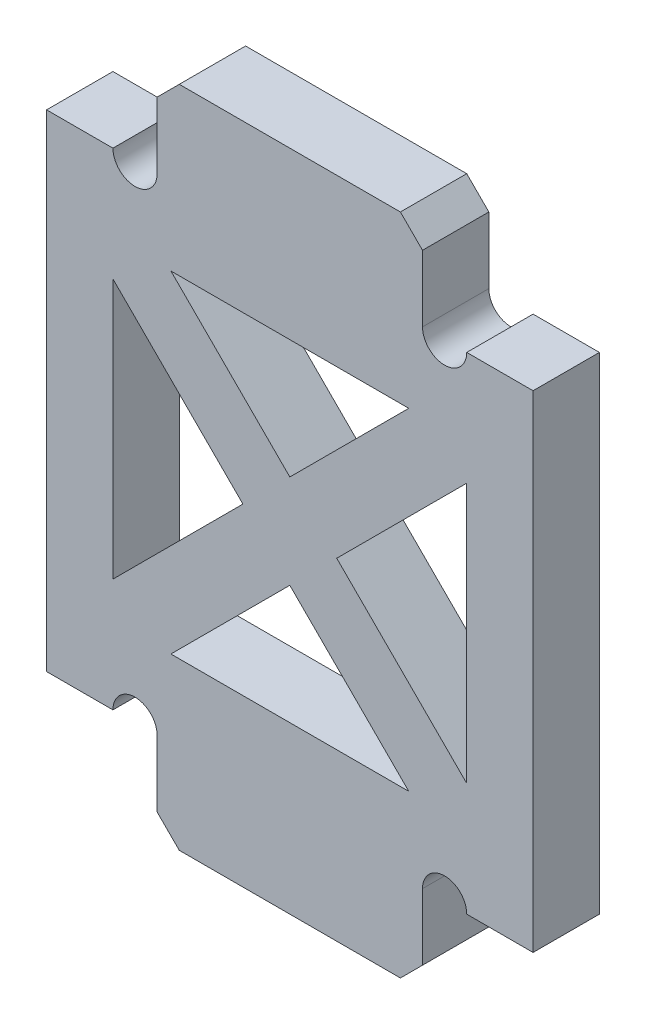
ISO-10303-21;
HEADER;
FILE_DESCRIPTION(('STEP AP214'),'2;1');
FILE_NAME('part.step','',(''),(''),'','','');
FILE_SCHEMA(('AUTOMOTIVE_DESIGN { 1 0 10303 214 1 1 1 1 }'));
ENDSEC;
DATA;
#1=APPLICATION_CONTEXT('core data for automotive mechanical design processes');
#2=APPLICATION_PROTOCOL_DEFINITION('international standard','automotive_design',2000,#1);
#3=PRODUCT_CONTEXT('',#1,'mechanical');
#4=PRODUCT('Part','Part','',(#3));
#5=PRODUCT_RELATED_PRODUCT_CATEGORY('part','',(#4));
#6=PRODUCT_DEFINITION_FORMATION('','',#4);
#7=PRODUCT_DEFINITION_CONTEXT('part definition',#1,'design');
#8=PRODUCT_DEFINITION('design','',#6,#7);
#9=PRODUCT_DEFINITION_SHAPE('','',#8);
#10=(LENGTH_UNIT() NAMED_UNIT(*) SI_UNIT(.MILLI.,.METRE.));
#11=(NAMED_UNIT(*) PLANE_ANGLE_UNIT() SI_UNIT($,.RADIAN.));
#12=(NAMED_UNIT(*) SI_UNIT($,.STERADIAN.) SOLID_ANGLE_UNIT());
#13=UNCERTAINTY_MEASURE_WITH_UNIT(LENGTH_MEASURE(1.E-05),#10,'distance_accuracy_value','');
#14=(GEOMETRIC_REPRESENTATION_CONTEXT(3) GLOBAL_UNCERTAINTY_ASSIGNED_CONTEXT((#13)) GLOBAL_UNIT_ASSIGNED_CONTEXT((#10,
#11,#12)) REPRESENTATION_CONTEXT('',''));
#15=CARTESIAN_POINT('',(0.,0.,0.));
#16=DIRECTION('',(0.,0.,1.));
#17=DIRECTION('',(1.,0.,0.));
#18=AXIS2_PLACEMENT_3D('',#15,#16,#17);
#19=CARTESIAN_POINT('',(0.,-11.,1.5));
#20=DIRECTION('',(0.,1.,0.));
#21=DIRECTION('',(0.,0.,1.));
#22=AXIS2_PLACEMENT_3D('',#19,#20,#21);
#23=PLANE('',#22);
#24=DIRECTION('',(1.,0.,0.));
#25=VECTOR('',#24,1.);
#26=CARTESIAN_POINT('',(0.,-11.,-1.5));
#27=LINE('',#26,#25);
#28=CARTESIAN_POINT('',(-11.,-11.,-1.5));
#29=VERTEX_POINT('',#28);
#30=CARTESIAN_POINT('',(-8.,-11.,-1.5));
#31=VERTEX_POINT('',#30);
#32=EDGE_CURVE('E373',#29,#31,#27,.T.);
#33=ORIENTED_EDGE('',*,*,#32,.T.);
#34=DIRECTION('',(0.,0.,-1.));
#35=VECTOR('',#34,1.);
#36=CARTESIAN_POINT('',(-8.,-11.,1.5));
#37=LINE('',#36,#35);
#38=CARTESIAN_POINT('',(-8.,-11.,1.5));
#39=VERTEX_POINT('',#38);
#40=EDGE_CURVE('E437',#39,#31,#37,.T.);
#41=ORIENTED_EDGE('',*,*,#40,.F.);
#42=DIRECTION('',(1.,0.,0.));
#43=VECTOR('',#42,1.);
#44=CARTESIAN_POINT('',(0.,-11.,1.5));
#45=LINE('',#44,#43);
#46=CARTESIAN_POINT('',(-11.,-11.,1.5));
#47=VERTEX_POINT('',#46);
#48=EDGE_CURVE('E301',#47,#39,#45,.T.);
#49=ORIENTED_EDGE('',*,*,#48,.F.);
#50=DIRECTION('',(0.,0.,-1.));
#51=VECTOR('',#50,1.);
#52=CARTESIAN_POINT('',(-11.,-11.,1.5));
#53=LINE('',#52,#51);
#54=EDGE_CURVE('E411',#47,#29,#53,.T.);
#55=ORIENTED_EDGE('',*,*,#54,.T.);
#56=EDGE_LOOP('',(#33,#41,#49,#55));
#57=FACE_BOUND('',#56,.T.);
#58=ADVANCED_FACE('F37',(#57),#23,.F.);
#59=CARTESIAN_POINT('',(-7.,-11.,1.5));
#60=DIRECTION('',(0.,0.,-1.));
#61=DIRECTION('',(-1.,0.,0.));
#62=AXIS2_PLACEMENT_3D('',#59,#60,#61);
#63=CYLINDRICAL_SURFACE('',#62,1.);
#64=CARTESIAN_POINT('',(-7.,-11.,-1.5));
#65=DIRECTION('',(0.,0.,1.));
#66=DIRECTION('',(1.,0.,0.));
#67=AXIS2_PLACEMENT_3D('',#64,#65,#66);
#68=CIRCLE('',#67,1.);
#69=CARTESIAN_POINT('',(-6.,-11.,-1.5));
#70=VERTEX_POINT('',#69);
#71=EDGE_CURVE('E376',#31,#70,#68,.F.);
#72=ORIENTED_EDGE('',*,*,#71,.T.);
#73=DIRECTION('',(0.,0.,-1.));
#74=VECTOR('',#73,1.);
#75=CARTESIAN_POINT('',(-6.,-11.,1.5));
#76=LINE('',#75,#74);
#77=CARTESIAN_POINT('',(-6.,-11.,1.5));
#78=VERTEX_POINT('',#77);
#79=EDGE_CURVE('E434',#78,#70,#76,.T.);
#80=ORIENTED_EDGE('',*,*,#79,.F.);
#81=CARTESIAN_POINT('',(-7.,-11.,1.5));
#82=DIRECTION('',(0.,0.,1.));
#83=DIRECTION('',(1.,0.,0.));
#84=AXIS2_PLACEMENT_3D('',#81,#82,#83);
#85=CIRCLE('',#84,1.);
#86=EDGE_CURVE('E304',#39,#78,#85,.F.);
#87=ORIENTED_EDGE('',*,*,#86,.F.);
#88=ORIENTED_EDGE('',*,*,#40,.T.);
#89=EDGE_LOOP('',(#72,#80,#87,#88));
#90=FACE_BOUND('',#89,.T.);
#91=ADVANCED_FACE('F529',(#90),#63,.F.);
#92=CARTESIAN_POINT('',(-6.,0.,1.5));
#93=DIRECTION('',(1.,0.,0.));
#94=DIRECTION('',(0.,0.,-1.));
#95=AXIS2_PLACEMENT_3D('',#92,#93,#94);
#96=PLANE('',#95);
#97=DIRECTION('',(0.,-1.,0.));
#98=VECTOR('',#97,1.);
#99=CARTESIAN_POINT('',(-6.,0.,-1.5));
#100=LINE('',#99,#98);
#101=CARTESIAN_POINT('',(-6.,-14.,-1.5));
#102=VERTEX_POINT('',#101);
#103=EDGE_CURVE('E379',#70,#102,#100,.T.);
#104=ORIENTED_EDGE('',*,*,#103,.T.);
#105=DIRECTION('',(0.,0.,1.));
#106=VECTOR('',#105,1.);
#107=CARTESIAN_POINT('',(-6.,-14.,1.5));
#108=LINE('',#107,#106);
#109=CARTESIAN_POINT('',(-6.,-14.,1.5));
#110=VERTEX_POINT('',#109);
#111=EDGE_CURVE('E481',#102,#110,#108,.T.);
#112=ORIENTED_EDGE('',*,*,#111,.T.);
#113=DIRECTION('',(0.,-1.,0.));
#114=VECTOR('',#113,1.);
#115=CARTESIAN_POINT('',(-6.,0.,1.5));
#116=LINE('',#115,#114);
#117=EDGE_CURVE('E307',#78,#110,#116,.T.);
#118=ORIENTED_EDGE('',*,*,#117,.F.);
#119=ORIENTED_EDGE('',*,*,#79,.T.);
#120=EDGE_LOOP('',(#104,#112,#118,#119));
#121=FACE_BOUND('',#120,.T.);
#122=ADVANCED_FACE('F585',(#121),#96,.F.);
#123=CARTESIAN_POINT('',(0.,-15.,1.5));
#124=DIRECTION('',(0.,1.,0.));
#125=DIRECTION('',(0.,0.,1.));
#126=AXIS2_PLACEMENT_3D('',#123,#124,#125);
#127=PLANE('',#126);
#128=DIRECTION('',(1.,0.,0.));
#129=VECTOR('',#128,1.);
#130=CARTESIAN_POINT('',(0.,-15.,-1.5));
#131=LINE('',#130,#129);
#132=CARTESIAN_POINT('',(-5.,-15.,-1.5));
#133=VERTEX_POINT('',#132);
#134=CARTESIAN_POINT('',(4.99999999999999,-15.,-1.5));
#135=VERTEX_POINT('',#134);
#136=EDGE_CURVE('E382',#133,#135,#131,.T.);
#137=ORIENTED_EDGE('',*,*,#136,.T.);
#138=DIRECTION('',(0.,0.,1.));
#139=VECTOR('',#138,1.);
#140=CARTESIAN_POINT('',(4.99999999999999,-15.,1.5));
#141=LINE('',#140,#139);
#142=CARTESIAN_POINT('',(4.99999999999999,-15.,1.5));
#143=VERTEX_POINT('',#142);
#144=EDGE_CURVE('E473',#135,#143,#141,.T.);
#145=ORIENTED_EDGE('',*,*,#144,.T.);
#146=DIRECTION('',(1.,0.,0.));
#147=VECTOR('',#146,1.);
#148=CARTESIAN_POINT('',(0.,-15.,1.5));
#149=LINE('',#148,#147);
#150=CARTESIAN_POINT('',(-5.,-15.,1.5));
#151=VERTEX_POINT('',#150);
#152=EDGE_CURVE('E310',#151,#143,#149,.T.);
#153=ORIENTED_EDGE('',*,*,#152,.F.);
#154=DIRECTION('',(0.,0.,-1.));
#155=VECTOR('',#154,1.);
#156=CARTESIAN_POINT('',(-5.,-15.,1.5));
#157=LINE('',#156,#155);
#158=EDGE_CURVE('E470',#151,#133,#157,.T.);
#159=ORIENTED_EDGE('',*,*,#158,.T.);
#160=EDGE_LOOP('',(#137,#145,#153,#159));
#161=FACE_BOUND('',#160,.T.);
#162=ADVANCED_FACE('F541',(#161),#127,.F.);
#163=CARTESIAN_POINT('',(6.,0.,1.5));
#164=DIRECTION('',(1.,0.,0.));
#165=DIRECTION('',(0.,0.,-1.));
#166=AXIS2_PLACEMENT_3D('',#163,#164,#165);
#167=PLANE('',#166);
#168=DIRECTION('',(0.,-1.,0.));
#169=VECTOR('',#168,1.);
#170=CARTESIAN_POINT('',(6.,0.,1.5));
#171=LINE('',#170,#169);
#172=CARTESIAN_POINT('',(6.,-11.,1.5));
#173=VERTEX_POINT('',#172);
#174=CARTESIAN_POINT('',(6.,-14.,1.5));
#175=VERTEX_POINT('',#174);
#176=EDGE_CURVE('E313',#173,#175,#171,.T.);
#177=ORIENTED_EDGE('',*,*,#176,.T.);
#178=DIRECTION('',(0.,0.,-1.));
#179=VECTOR('',#178,1.);
#180=CARTESIAN_POINT('',(6.,-14.,-1.5));
#181=LINE('',#180,#179);
#182=CARTESIAN_POINT('',(6.,-14.,-1.5));
#183=VERTEX_POINT('',#182);
#184=EDGE_CURVE('E440',#175,#183,#181,.T.);
#185=ORIENTED_EDGE('',*,*,#184,.T.);
#186=DIRECTION('',(0.,-1.,0.));
#187=VECTOR('',#186,1.);
#188=CARTESIAN_POINT('',(6.,0.,-1.5));
#189=LINE('',#188,#187);
#190=CARTESIAN_POINT('',(6.,-11.,-1.5));
#191=VERTEX_POINT('',#190);
#192=EDGE_CURVE('E385',#191,#183,#189,.T.);
#193=ORIENTED_EDGE('',*,*,#192,.F.);
#194=DIRECTION('',(0.,0.,-1.));
#195=VECTOR('',#194,1.);
#196=CARTESIAN_POINT('',(6.,-11.,1.5));
#197=LINE('',#196,#195);
#198=EDGE_CURVE('E432',#173,#191,#197,.T.);
#199=ORIENTED_EDGE('',*,*,#198,.F.);
#200=EDGE_LOOP('',(#177,#185,#193,#199));
#201=FACE_BOUND('',#200,.T.);
#202=ADVANCED_FACE('F550',(#201),#167,.T.);
#203=CARTESIAN_POINT('',(7.,-11.,1.5));
#204=DIRECTION('',(0.,0.,-1.));
#205=DIRECTION('',(-1.,0.,0.));
#206=AXIS2_PLACEMENT_3D('',#203,#204,#205);
#207=CYLINDRICAL_SURFACE('',#206,1.);
#208=CARTESIAN_POINT('',(7.,-11.,-1.5));
#209=DIRECTION('',(0.,0.,1.));
#210=DIRECTION('',(1.,0.,0.));
#211=AXIS2_PLACEMENT_3D('',#208,#209,#210);
#212=CIRCLE('',#211,1.);
#213=CARTESIAN_POINT('',(8.,-11.,-1.5));
#214=VERTEX_POINT('',#213);
#215=EDGE_CURVE('E388',#214,#191,#212,.T.);
#216=ORIENTED_EDGE('',*,*,#215,.F.);
#217=DIRECTION('',(0.,0.,-1.));
#218=VECTOR('',#217,1.);
#219=CARTESIAN_POINT('',(8.,-11.,1.5));
#220=LINE('',#219,#218);
#221=CARTESIAN_POINT('',(8.,-11.,1.5));
#222=VERTEX_POINT('',#221);
#223=EDGE_CURVE('E430',#222,#214,#220,.T.);
#224=ORIENTED_EDGE('',*,*,#223,.F.);
#225=CARTESIAN_POINT('',(7.,-11.,1.5));
#226=DIRECTION('',(0.,0.,1.));
#227=DIRECTION('',(1.,0.,0.));
#228=AXIS2_PLACEMENT_3D('',#225,#226,#227);
#229=CIRCLE('',#228,1.);
#230=EDGE_CURVE('E316',#222,#173,#229,.T.);
#231=ORIENTED_EDGE('',*,*,#230,.T.);
#232=ORIENTED_EDGE('',*,*,#198,.T.);
#233=EDGE_LOOP('',(#216,#224,#231,#232));
#234=FACE_BOUND('',#233,.T.);
#235=ADVANCED_FACE('F555',(#234),#207,.F.);
#236=CARTESIAN_POINT('',(11.,-11.,-1.5));
#237=VERTEX_POINT('',#236);
#238=EDGE_CURVE('E377',#214,#237,#27,.T.);
#239=ORIENTED_EDGE('',*,*,#238,.T.);
#240=DIRECTION('',(0.,0.,-1.));
#241=VECTOR('',#240,1.);
#242=CARTESIAN_POINT('',(11.,-11.,1.5));
#243=LINE('',#242,#241);
#244=CARTESIAN_POINT('',(11.,-11.,1.5));
#245=VERTEX_POINT('',#244);
#246=EDGE_CURVE('E428',#245,#237,#243,.T.);
#247=ORIENTED_EDGE('',*,*,#246,.F.);
#248=EDGE_CURVE('E305',#222,#245,#45,.T.);
#249=ORIENTED_EDGE('',*,*,#248,.F.);
#250=ORIENTED_EDGE('',*,*,#223,.T.);
#251=EDGE_LOOP('',(#239,#247,#249,#250));
#252=FACE_BOUND('',#251,.T.);
#253=ADVANCED_FACE('F561',(#252),#23,.F.);
#254=CARTESIAN_POINT('',(11.,0.,1.5));
#255=DIRECTION('',(1.,0.,0.));
#256=DIRECTION('',(0.,0.,-1.));
#257=AXIS2_PLACEMENT_3D('',#254,#255,#256);
#258=PLANE('',#257);
#259=DIRECTION('',(0.,-1.,0.));
#260=VECTOR('',#259,1.);
#261=CARTESIAN_POINT('',(11.,0.,-1.5));
#262=LINE('',#261,#260);
#263=CARTESIAN_POINT('',(11.,11.,-1.5));
#264=VERTEX_POINT('',#263);
#265=EDGE_CURVE('E391',#264,#237,#262,.T.);
#266=ORIENTED_EDGE('',*,*,#265,.F.);
#267=DIRECTION('',(0.,0.,-1.));
#268=VECTOR('',#267,1.);
#269=CARTESIAN_POINT('',(11.,11.,1.5));
#270=LINE('',#269,#268);
#271=CARTESIAN_POINT('',(11.,11.,1.5));
#272=VERTEX_POINT('',#271);
#273=EDGE_CURVE('E426',#272,#264,#270,.T.);
#274=ORIENTED_EDGE('',*,*,#273,.F.);
#275=DIRECTION('',(0.,-1.,0.));
#276=VECTOR('',#275,1.);
#277=CARTESIAN_POINT('',(11.,0.,1.5));
#278=LINE('',#277,#276);
#279=EDGE_CURVE('E319',#272,#245,#278,.T.);
#280=ORIENTED_EDGE('',*,*,#279,.T.);
#281=ORIENTED_EDGE('',*,*,#246,.T.);
#282=EDGE_LOOP('',(#266,#274,#280,#281));
#283=FACE_BOUND('',#282,.T.);
#284=ADVANCED_FACE('F571',(#283),#258,.T.);
#285=CARTESIAN_POINT('',(0.,11.,1.5));
#286=DIRECTION('',(0.,1.,0.));
#287=DIRECTION('',(0.,0.,1.));
#288=AXIS2_PLACEMENT_3D('',#285,#286,#287);
#289=PLANE('',#288);
#290=DIRECTION('',(1.,0.,0.));
#291=VECTOR('',#290,1.);
#292=CARTESIAN_POINT('',(0.,11.,-1.5));
#293=LINE('',#292,#291);
#294=CARTESIAN_POINT('',(8.,11.,-1.5));
#295=VERTEX_POINT('',#294);
#296=EDGE_CURVE('E394',#295,#264,#293,.T.);
#297=ORIENTED_EDGE('',*,*,#296,.F.);
#298=DIRECTION('',(0.,0.,-1.));
#299=VECTOR('',#298,1.);
#300=CARTESIAN_POINT('',(8.,11.,1.5));
#301=LINE('',#300,#299);
#302=CARTESIAN_POINT('',(8.,11.,1.5));
#303=VERTEX_POINT('',#302);
#304=EDGE_CURVE('E424',#303,#295,#301,.T.);
#305=ORIENTED_EDGE('',*,*,#304,.F.);
#306=DIRECTION('',(1.,0.,0.));
#307=VECTOR('',#306,1.);
#308=CARTESIAN_POINT('',(0.,11.,1.5));
#309=LINE('',#308,#307);
#310=EDGE_CURVE('E322',#303,#272,#309,.T.);
#311=ORIENTED_EDGE('',*,*,#310,.T.);
#312=ORIENTED_EDGE('',*,*,#273,.T.);
#313=EDGE_LOOP('',(#297,#305,#311,#312));
#314=FACE_BOUND('',#313,.T.);
#315=ADVANCED_FACE('F566',(#314),#289,.T.);
#316=CARTESIAN_POINT('',(7.,11.,1.5));
#317=DIRECTION('',(0.,0.,-1.));
#318=DIRECTION('',(-1.,0.,0.));
#319=AXIS2_PLACEMENT_3D('',#316,#317,#318);
#320=CYLINDRICAL_SURFACE('',#319,1.);
#321=CARTESIAN_POINT('',(7.,11.,-1.5));
#322=DIRECTION('',(0.,0.,1.));
#323=DIRECTION('',(1.,0.,0.));
#324=AXIS2_PLACEMENT_3D('',#321,#322,#323);
#325=CIRCLE('',#324,1.);
#326=CARTESIAN_POINT('',(6.,11.,-1.5));
#327=VERTEX_POINT('',#326);
#328=EDGE_CURVE('E397',#295,#327,#325,.F.);
#329=ORIENTED_EDGE('',*,*,#328,.T.);
#330=DIRECTION('',(0.,0.,-1.));
#331=VECTOR('',#330,1.);
#332=CARTESIAN_POINT('',(6.,11.,1.5));
#333=LINE('',#332,#331);
#334=CARTESIAN_POINT('',(6.,11.,1.5));
#335=VERTEX_POINT('',#334);
#336=EDGE_CURVE('E421',#335,#327,#333,.T.);
#337=ORIENTED_EDGE('',*,*,#336,.F.);
#338=CARTESIAN_POINT('',(7.,11.,1.5));
#339=DIRECTION('',(0.,0.,1.));
#340=DIRECTION('',(1.,0.,0.));
#341=AXIS2_PLACEMENT_3D('',#338,#339,#340);
#342=CIRCLE('',#341,1.);
#343=EDGE_CURVE('E325',#303,#335,#342,.F.);
#344=ORIENTED_EDGE('',*,*,#343,.F.);
#345=ORIENTED_EDGE('',*,*,#304,.T.);
#346=EDGE_LOOP('',(#329,#337,#344,#345));
#347=FACE_BOUND('',#346,.T.);
#348=ADVANCED_FACE('F570',(#347),#320,.F.);
#349=CARTESIAN_POINT('',(6.,0.,1.5));
#350=DIRECTION('',(-1.,0.,0.));
#351=DIRECTION('',(0.,0.,1.));
#352=AXIS2_PLACEMENT_3D('',#349,#350,#351);
#353=PLANE('',#352);
#354=DIRECTION('',(0.,1.,0.));
#355=VECTOR('',#354,1.);
#356=CARTESIAN_POINT('',(6.,0.,-1.5));
#357=LINE('',#356,#355);
#358=CARTESIAN_POINT('',(6.,14.,-1.5));
#359=VERTEX_POINT('',#358);
#360=EDGE_CURVE('E399',#327,#359,#357,.T.);
#361=ORIENTED_EDGE('',*,*,#360,.T.);
#362=DIRECTION('',(0.,0.,1.));
#363=VECTOR('',#362,1.);
#364=CARTESIAN_POINT('',(6.,14.,1.5));
#365=LINE('',#364,#363);
#366=CARTESIAN_POINT('',(6.,14.,1.5));
#367=VERTEX_POINT('',#366);
#368=EDGE_CURVE('E45',#359,#367,#365,.T.);
#369=ORIENTED_EDGE('',*,*,#368,.T.);
#370=DIRECTION('',(0.,1.,0.));
#371=VECTOR('',#370,1.);
#372=CARTESIAN_POINT('',(6.,0.,1.5));
#373=LINE('',#372,#371);
#374=EDGE_CURVE('E328',#335,#367,#373,.T.);
#375=ORIENTED_EDGE('',*,*,#374,.F.);
#376=ORIENTED_EDGE('',*,*,#336,.T.);
#377=EDGE_LOOP('',(#361,#369,#375,#376));
#378=FACE_BOUND('',#377,.T.);
#379=ADVANCED_FACE('F490',(#378),#353,.F.);
#380=CARTESIAN_POINT('',(0.,15.,1.5));
#381=DIRECTION('',(0.,1.,0.));
#382=DIRECTION('',(0.,0.,1.));
#383=AXIS2_PLACEMENT_3D('',#380,#381,#382);
#384=PLANE('',#383);
#385=DIRECTION('',(1.,0.,0.));
#386=VECTOR('',#385,1.);
#387=CARTESIAN_POINT('',(0.,15.,1.5));
#388=LINE('',#387,#386);
#389=CARTESIAN_POINT('',(-4.99999999999999,15.,1.5));
#390=VERTEX_POINT('',#389);
#391=CARTESIAN_POINT('',(5.,15.,1.5));
#392=VERTEX_POINT('',#391);
#393=EDGE_CURVE('E330',#390,#392,#388,.T.);
#394=ORIENTED_EDGE('',*,*,#393,.T.);
#395=DIRECTION('',(0.,0.,-1.));
#396=VECTOR('',#395,1.);
#397=CARTESIAN_POINT('',(5.,15.,-1.5));
#398=LINE('',#397,#396);
#399=CARTESIAN_POINT('',(5.,15.,-1.5));
#400=VERTEX_POINT('',#399);
#401=EDGE_CURVE('E485',#392,#400,#398,.T.);
#402=ORIENTED_EDGE('',*,*,#401,.T.);
#403=DIRECTION('',(1.,0.,0.));
#404=VECTOR('',#403,1.);
#405=CARTESIAN_POINT('',(0.,15.,-1.5));
#406=LINE('',#405,#404);
#407=CARTESIAN_POINT('',(-4.99999999999999,15.,-1.5));
#408=VERTEX_POINT('',#407);
#409=EDGE_CURVE('E402',#408,#400,#406,.T.);
#410=ORIENTED_EDGE('',*,*,#409,.F.);
#411=DIRECTION('',(0.,0.,1.));
#412=VECTOR('',#411,1.);
#413=CARTESIAN_POINT('',(-4.99999999999999,15.,1.5));
#414=LINE('',#413,#412);
#415=EDGE_CURVE('E483',#408,#390,#414,.T.);
#416=ORIENTED_EDGE('',*,*,#415,.T.);
#417=EDGE_LOOP('',(#394,#402,#410,#416));
#418=FACE_BOUND('',#417,.T.);
#419=ADVANCED_FACE('F500',(#418),#384,.T.);
#420=CARTESIAN_POINT('',(-6.,0.,1.5));
#421=DIRECTION('',(-1.,0.,0.));
#422=DIRECTION('',(0.,0.,1.));
#423=AXIS2_PLACEMENT_3D('',#420,#421,#422);
#424=PLANE('',#423);
#425=DIRECTION('',(0.,1.,0.));
#426=VECTOR('',#425,1.);
#427=CARTESIAN_POINT('',(-6.,0.,1.5));
#428=LINE('',#427,#426);
#429=CARTESIAN_POINT('',(-6.,11.,1.5));
#430=VERTEX_POINT('',#429);
#431=CARTESIAN_POINT('',(-6.,14.,1.5));
#432=VERTEX_POINT('',#431);
#433=EDGE_CURVE('E332',#430,#432,#428,.T.);
#434=ORIENTED_EDGE('',*,*,#433,.T.);
#435=DIRECTION('',(0.,0.,-1.));
#436=VECTOR('',#435,1.);
#437=CARTESIAN_POINT('',(-6.,14.,1.5));
#438=LINE('',#437,#436);
#439=CARTESIAN_POINT('',(-6.,14.,-1.5));
#440=VERTEX_POINT('',#439);
#441=EDGE_CURVE('E11',#432,#440,#438,.T.);
#442=ORIENTED_EDGE('',*,*,#441,.T.);
#443=DIRECTION('',(0.,1.,0.));
#444=VECTOR('',#443,1.);
#445=CARTESIAN_POINT('',(-6.,0.,-1.5));
#446=LINE('',#445,#444);
#447=CARTESIAN_POINT('',(-6.,11.,-1.5));
#448=VERTEX_POINT('',#447);
#449=EDGE_CURVE('E405',#448,#440,#446,.T.);
#450=ORIENTED_EDGE('',*,*,#449,.F.);
#451=DIRECTION('',(0.,0.,-1.));
#452=VECTOR('',#451,1.);
#453=CARTESIAN_POINT('',(-6.,11.,1.5));
#454=LINE('',#453,#452);
#455=EDGE_CURVE('E419',#430,#448,#454,.T.);
#456=ORIENTED_EDGE('',*,*,#455,.F.);
#457=EDGE_LOOP('',(#434,#442,#450,#456));
#458=FACE_BOUND('',#457,.T.);
#459=ADVANCED_FACE('F508',(#458),#424,.T.);
#460=CARTESIAN_POINT('',(-7.,11.,1.5));
#461=DIRECTION('',(0.,0.,-1.));
#462=DIRECTION('',(-1.,0.,0.));
#463=AXIS2_PLACEMENT_3D('',#460,#461,#462);
#464=CYLINDRICAL_SURFACE('',#463,1.);
#465=CARTESIAN_POINT('',(-7.,11.,-1.5));
#466=DIRECTION('',(0.,0.,1.));
#467=DIRECTION('',(1.,0.,0.));
#468=AXIS2_PLACEMENT_3D('',#465,#466,#467);
#469=CIRCLE('',#468,1.);
#470=CARTESIAN_POINT('',(-8.,11.,-1.5));
#471=VERTEX_POINT('',#470);
#472=EDGE_CURVE('E408',#471,#448,#469,.T.);
#473=ORIENTED_EDGE('',*,*,#472,.F.);
#474=DIRECTION('',(0.,0.,-1.));
#475=VECTOR('',#474,1.);
#476=CARTESIAN_POINT('',(-8.,11.,1.5));
#477=LINE('',#476,#475);
#478=CARTESIAN_POINT('',(-8.,11.,1.5));
#479=VERTEX_POINT('',#478);
#480=EDGE_CURVE('E417',#479,#471,#477,.T.);
#481=ORIENTED_EDGE('',*,*,#480,.F.);
#482=CARTESIAN_POINT('',(-7.,11.,1.5));
#483=DIRECTION('',(0.,0.,1.));
#484=DIRECTION('',(1.,0.,0.));
#485=AXIS2_PLACEMENT_3D('',#482,#483,#484);
#486=CIRCLE('',#485,1.);
#487=EDGE_CURVE('E334',#479,#430,#486,.T.);
#488=ORIENTED_EDGE('',*,*,#487,.T.);
#489=ORIENTED_EDGE('',*,*,#455,.T.);
#490=EDGE_LOOP('',(#473,#481,#488,#489));
#491=FACE_BOUND('',#490,.T.);
#492=ADVANCED_FACE('F514',(#491),#464,.F.);
#493=CARTESIAN_POINT('',(-11.,11.,-1.5));
#494=VERTEX_POINT('',#493);
#495=EDGE_CURVE('E273',#494,#471,#293,.T.);
#496=ORIENTED_EDGE('',*,*,#495,.F.);
#497=DIRECTION('',(0.,0.,-1.));
#498=VECTOR('',#497,1.);
#499=CARTESIAN_POINT('',(-11.,11.,1.5));
#500=LINE('',#499,#498);
#501=CARTESIAN_POINT('',(-11.,11.,1.5));
#502=VERTEX_POINT('',#501);
#503=EDGE_CURVE('E414',#502,#494,#500,.T.);
#504=ORIENTED_EDGE('',*,*,#503,.F.);
#505=EDGE_CURVE('E326',#502,#479,#309,.T.);
#506=ORIENTED_EDGE('',*,*,#505,.T.);
#507=ORIENTED_EDGE('',*,*,#480,.T.);
#508=EDGE_LOOP('',(#496,#504,#506,#507));
#509=FACE_BOUND('',#508,.T.);
#510=ADVANCED_FACE('F518',(#509),#289,.T.);
#511=CARTESIAN_POINT('',(-1.06066017177983,-1.06066017177982,1.5));
#512=DIRECTION('',(-0.707106781186548,-0.707106781186547,0.));
#513=DIRECTION('',(0.707106781186547,-0.707106781186548,0.));
#514=AXIS2_PLACEMENT_3D('',#511,#512,#513);
#515=PLANE('',#514);
#516=DIRECTION('',(-0.707106781186547,0.707106781186548,0.));
#517=VECTOR('',#516,1.);
#518=CARTESIAN_POINT('',(-1.06066017177983,-1.06066017177982,-1.5));
#519=LINE('',#518,#517);
#520=CARTESIAN_POINT('',(-2.12132034355965,0.,-1.5));
#521=VERTEX_POINT('',#520);
#522=CARTESIAN_POINT('',(-8.,5.87867965644036,-1.5));
#523=VERTEX_POINT('',#522);
#524=EDGE_CURVE('E364',#521,#523,#519,.T.);
#525=ORIENTED_EDGE('',*,*,#524,.F.);
#526=DIRECTION('',(0.,0.,-1.));
#527=VECTOR('',#526,1.);
#528=CARTESIAN_POINT('',(-2.12132034355965,0.,1.5));
#529=LINE('',#528,#527);
#530=CARTESIAN_POINT('',(-2.12132034355965,0.,1.5));
#531=VERTEX_POINT('',#530);
#532=EDGE_CURVE('E415',#531,#521,#529,.T.);
#533=ORIENTED_EDGE('',*,*,#532,.F.);
#534=DIRECTION('',(-0.707106781186547,0.707106781186548,0.));
#535=VECTOR('',#534,1.);
#536=CARTESIAN_POINT('',(-1.06066017177983,-1.06066017177982,1.5));
#537=LINE('',#536,#535);
#538=CARTESIAN_POINT('',(-8.,5.87867965644036,1.5));
#539=VERTEX_POINT('',#538);
#540=EDGE_CURVE('E293',#531,#539,#537,.T.);
#541=ORIENTED_EDGE('',*,*,#540,.T.);
#542=DIRECTION('',(0.,0.,-1.));
#543=VECTOR('',#542,1.);
#544=CARTESIAN_POINT('',(-8.,5.87867965644036,1.5));
#545=LINE('',#544,#543);
#546=EDGE_CURVE('E441',#539,#523,#545,.T.);
#547=ORIENTED_EDGE('',*,*,#546,.T.);
#548=EDGE_LOOP('',(#525,#533,#541,#547));
#549=FACE_BOUND('',#548,.T.);
#550=ADVANCED_FACE('F605',(#549),#515,.T.);
#551=CARTESIAN_POINT('',(-1.06066017177983,1.06066017177982,1.5));
#552=DIRECTION('',(0.707106781186548,-0.707106781186547,0.));
#553=DIRECTION('',(0.707106781186547,0.707106781186548,0.));
#554=AXIS2_PLACEMENT_3D('',#551,#552,#553);
#555=PLANE('',#554);
#556=DIRECTION('',(-0.707106781186547,-0.707106781186548,0.));
#557=VECTOR('',#556,1.);
#558=CARTESIAN_POINT('',(-1.06066017177983,1.06066017177982,-1.5));
#559=LINE('',#558,#557);
#560=CARTESIAN_POINT('',(-8.,-5.87867965644036,-1.5));
#561=VERTEX_POINT('',#560);
#562=EDGE_CURVE('E367',#521,#561,#559,.T.);
#563=ORIENTED_EDGE('',*,*,#562,.T.);
#564=DIRECTION('',(0.,0.,-1.));
#565=VECTOR('',#564,1.);
#566=CARTESIAN_POINT('',(-8.,-5.87867965644036,1.5));
#567=LINE('',#566,#565);
#568=CARTESIAN_POINT('',(-8.,-5.87867965644036,1.5));
#569=VERTEX_POINT('',#568);
#570=EDGE_CURVE('E443',#569,#561,#567,.T.);
#571=ORIENTED_EDGE('',*,*,#570,.F.);
#572=DIRECTION('',(-0.707106781186547,-0.707106781186548,0.));
#573=VECTOR('',#572,1.);
#574=CARTESIAN_POINT('',(-1.06066017177983,1.06066017177982,1.5));
#575=LINE('',#574,#573);
#576=EDGE_CURVE('E296',#531,#569,#575,.T.);
#577=ORIENTED_EDGE('',*,*,#576,.F.);
#578=ORIENTED_EDGE('',*,*,#532,.T.);
#579=EDGE_LOOP('',(#563,#571,#577,#578));
#580=FACE_BOUND('',#579,.T.);
#581=ADVANCED_FACE('F601',(#580),#555,.F.);
#582=CARTESIAN_POINT('',(0.,7.5,1.5));
#583=DIRECTION('',(0.,-1.,0.));
#584=DIRECTION('',(0.,0.,-1.));
#585=AXIS2_PLACEMENT_3D('',#582,#583,#584);
#586=PLANE('',#585);
#587=DIRECTION('',(-1.,0.,0.));
#588=VECTOR('',#587,1.);
#589=CARTESIAN_POINT('',(0.,7.5,-1.5));
#590=LINE('',#589,#588);
#591=CARTESIAN_POINT('',(5.37867965644036,7.5,-1.5));
#592=VERTEX_POINT('',#591);
#593=CARTESIAN_POINT('',(-5.37867965644036,7.5,-1.5));
#594=VERTEX_POINT('',#593);
#595=EDGE_CURVE('E355',#592,#594,#590,.T.);
#596=ORIENTED_EDGE('',*,*,#595,.F.);
#597=DIRECTION('',(0.,0.,-1.));
#598=VECTOR('',#597,1.);
#599=CARTESIAN_POINT('',(5.37867965644036,7.5,1.5));
#600=LINE('',#599,#598);
#601=CARTESIAN_POINT('',(5.37867965644036,7.5,1.5));
#602=VERTEX_POINT('',#601);
#603=EDGE_CURVE('E444',#602,#592,#600,.T.);
#604=ORIENTED_EDGE('',*,*,#603,.F.);
#605=DIRECTION('',(-1.,0.,0.));
#606=VECTOR('',#605,1.);
#607=CARTESIAN_POINT('',(0.,7.5,1.5));
#608=LINE('',#607,#606);
#609=CARTESIAN_POINT('',(-5.37867965644036,7.5,1.5));
#610=VERTEX_POINT('',#609);
#611=EDGE_CURVE('E285',#602,#610,#608,.T.);
#612=ORIENTED_EDGE('',*,*,#611,.T.);
#613=DIRECTION('',(0.,0.,-1.));
#614=VECTOR('',#613,1.);
#615=CARTESIAN_POINT('',(-5.37867965644036,7.5,1.5));
#616=LINE('',#615,#614);
#617=EDGE_CURVE('E447',#610,#594,#616,.T.);
#618=ORIENTED_EDGE('',*,*,#617,.T.);
#619=EDGE_LOOP('',(#596,#604,#612,#618));
#620=FACE_BOUND('',#619,.T.);
#621=ADVANCED_FACE('F604',(#620),#586,.T.);
#622=CARTESIAN_POINT('',(-1.06066017177982,1.06066017177982,1.5));
#623=DIRECTION('',(0.707106781186548,-0.707106781186547,0.));
#624=DIRECTION('',(0.707106781186547,0.707106781186548,0.));
#625=AXIS2_PLACEMENT_3D('',#622,#623,#624);
#626=PLANE('',#625);
#627=DIRECTION('',(-0.707106781186547,-0.707106781186548,0.));
#628=VECTOR('',#627,1.);
#629=CARTESIAN_POINT('',(-1.06066017177982,1.06066017177982,-1.5));
#630=LINE('',#629,#628);
#631=CARTESIAN_POINT('',(0.,2.12132034355964,-1.5));
#632=VERTEX_POINT('',#631);
#633=EDGE_CURVE('E358',#592,#632,#630,.T.);
#634=ORIENTED_EDGE('',*,*,#633,.T.);
#635=DIRECTION('',(0.,0.,-1.));
#636=VECTOR('',#635,1.);
#637=CARTESIAN_POINT('',(0.,2.12132034355964,1.5));
#638=LINE('',#637,#636);
#639=CARTESIAN_POINT('',(0.,2.12132034355964,1.5));
#640=VERTEX_POINT('',#639);
#641=EDGE_CURVE('E449',#640,#632,#638,.T.);
#642=ORIENTED_EDGE('',*,*,#641,.F.);
#643=DIRECTION('',(-0.707106781186547,-0.707106781186548,0.));
#644=VECTOR('',#643,1.);
#645=CARTESIAN_POINT('',(-1.06066017177982,1.06066017177982,1.5));
#646=LINE('',#645,#644);
#647=EDGE_CURVE('E288',#602,#640,#646,.T.);
#648=ORIENTED_EDGE('',*,*,#647,.F.);
#649=ORIENTED_EDGE('',*,*,#603,.T.);
#650=EDGE_LOOP('',(#634,#642,#648,#649));
#651=FACE_BOUND('',#650,.T.);
#652=ADVANCED_FACE('F614',(#651),#626,.F.);
#653=CARTESIAN_POINT('',(1.06066017177983,1.06066017177982,1.5));
#654=DIRECTION('',(0.707106781186548,0.707106781186547,0.));
#655=DIRECTION('',(-0.707106781186547,0.707106781186548,0.));
#656=AXIS2_PLACEMENT_3D('',#653,#654,#655);
#657=PLANE('',#656);
#658=DIRECTION('',(0.707106781186547,-0.707106781186548,0.));
#659=VECTOR('',#658,1.);
#660=CARTESIAN_POINT('',(1.06066017177983,1.06066017177982,-1.5));
#661=LINE('',#660,#659);
#662=CARTESIAN_POINT('',(2.12132034355965,0.,-1.5));
#663=VERTEX_POINT('',#662);
#664=CARTESIAN_POINT('',(8.,-5.87867965644036,-1.5));
#665=VERTEX_POINT('',#664);
#666=EDGE_CURVE('E346',#663,#665,#661,.T.);
#667=ORIENTED_EDGE('',*,*,#666,.F.);
#668=DIRECTION('',(0.,0.,-1.));
#669=VECTOR('',#668,1.);
#670=CARTESIAN_POINT('',(2.12132034355965,0.,1.5));
#671=LINE('',#670,#669);
#672=CARTESIAN_POINT('',(2.12132034355965,0.,1.5));
#673=VERTEX_POINT('',#672);
#674=EDGE_CURVE('E450',#673,#663,#671,.T.);
#675=ORIENTED_EDGE('',*,*,#674,.F.);
#676=DIRECTION('',(0.707106781186547,-0.707106781186548,0.));
#677=VECTOR('',#676,1.);
#678=CARTESIAN_POINT('',(1.06066017177983,1.06066017177982,1.5));
#679=LINE('',#678,#677);
#680=CARTESIAN_POINT('',(8.,-5.87867965644036,1.5));
#681=VERTEX_POINT('',#680);
#682=EDGE_CURVE('E277',#673,#681,#679,.T.);
#683=ORIENTED_EDGE('',*,*,#682,.T.);
#684=DIRECTION('',(0.,0.,-1.));
#685=VECTOR('',#684,1.);
#686=CARTESIAN_POINT('',(8.,-5.87867965644036,1.5));
#687=LINE('',#686,#685);
#688=EDGE_CURVE('E257',#681,#665,#687,.T.);
#689=ORIENTED_EDGE('',*,*,#688,.T.);
#690=EDGE_LOOP('',(#667,#675,#683,#689));
#691=FACE_BOUND('',#690,.T.);
#692=ADVANCED_FACE('F617',(#691),#657,.T.);
#693=CARTESIAN_POINT('',(1.06066017177983,-1.06066017177982,1.5));
#694=DIRECTION('',(-0.707106781186548,0.707106781186547,0.));
#695=DIRECTION('',(-0.707106781186547,-0.707106781186548,0.));
#696=AXIS2_PLACEMENT_3D('',#693,#694,#695);
#697=PLANE('',#696);
#698=DIRECTION('',(0.707106781186547,0.707106781186548,0.));
#699=VECTOR('',#698,1.);
#700=CARTESIAN_POINT('',(1.06066017177983,-1.06066017177982,-1.5));
#701=LINE('',#700,#699);
#702=CARTESIAN_POINT('',(8.,5.87867965644036,-1.5));
#703=VERTEX_POINT('',#702);
#704=EDGE_CURVE('E349',#663,#703,#701,.T.);
#705=ORIENTED_EDGE('',*,*,#704,.T.);
#706=DIRECTION('',(0.,0.,-1.));
#707=VECTOR('',#706,1.);
#708=CARTESIAN_POINT('',(8.,5.87867965644036,1.5));
#709=LINE('',#708,#707);
#710=CARTESIAN_POINT('',(8.,5.87867965644036,1.5));
#711=VERTEX_POINT('',#710);
#712=EDGE_CURVE('E454',#711,#703,#709,.T.);
#713=ORIENTED_EDGE('',*,*,#712,.F.);
#714=DIRECTION('',(0.707106781186547,0.707106781186548,0.));
#715=VECTOR('',#714,1.);
#716=CARTESIAN_POINT('',(1.06066017177983,-1.06066017177982,1.5));
#717=LINE('',#716,#715);
#718=EDGE_CURVE('E280',#673,#711,#717,.T.);
#719=ORIENTED_EDGE('',*,*,#718,.F.);
#720=ORIENTED_EDGE('',*,*,#674,.T.);
#721=EDGE_LOOP('',(#705,#713,#719,#720));
#722=FACE_BOUND('',#721,.T.);
#723=ADVANCED_FACE('F626',(#722),#697,.F.);
#724=CARTESIAN_POINT('',(-1.06066017177982,-1.06066017177982,1.5));
#725=DIRECTION('',(-0.707106781186548,-0.707106781186547,0.));
#726=DIRECTION('',(0.707106781186547,-0.707106781186548,0.));
#727=AXIS2_PLACEMENT_3D('',#724,#725,#726);
#728=PLANE('',#727);
#729=DIRECTION('',(-0.707106781186547,0.707106781186548,0.));
#730=VECTOR('',#729,1.);
#731=CARTESIAN_POINT('',(-1.06066017177982,-1.06066017177982,-1.5));
#732=LINE('',#731,#730);
#733=CARTESIAN_POINT('',(5.37867965644036,-7.5,-1.5));
#734=VERTEX_POINT('',#733);
#735=CARTESIAN_POINT('',(0.,-2.12132034355964,-1.5));
#736=VERTEX_POINT('',#735);
#737=EDGE_CURVE('E254',#734,#736,#732,.T.);
#738=ORIENTED_EDGE('',*,*,#737,.F.);
#739=DIRECTION('',(0.,0.,-1.));
#740=VECTOR('',#739,1.);
#741=CARTESIAN_POINT('',(5.37867965644036,-7.5,1.5));
#742=LINE('',#741,#740);
#743=CARTESIAN_POINT('',(5.37867965644036,-7.5,1.5));
#744=VERTEX_POINT('',#743);
#745=EDGE_CURVE('E248',#744,#734,#742,.T.);
#746=ORIENTED_EDGE('',*,*,#745,.F.);
#747=DIRECTION('',(-0.707106781186547,0.707106781186548,0.));
#748=VECTOR('',#747,1.);
#749=CARTESIAN_POINT('',(-1.06066017177982,-1.06066017177982,1.5));
#750=LINE('',#749,#748);
#751=CARTESIAN_POINT('',(0.,-2.12132034355964,1.5));
#752=VERTEX_POINT('',#751);
#753=EDGE_CURVE('E252',#744,#752,#750,.T.);
#754=ORIENTED_EDGE('',*,*,#753,.T.);
#755=DIRECTION('',(0.,0.,-1.));
#756=VECTOR('',#755,1.);
#757=CARTESIAN_POINT('',(0.,-2.12132034355964,1.5));
#758=LINE('',#757,#756);
#759=EDGE_CURVE('E339',#752,#736,#758,.T.);
#760=ORIENTED_EDGE('',*,*,#759,.T.);
#761=EDGE_LOOP('',(#738,#746,#754,#760));
#762=FACE_BOUND('',#761,.T.);
#763=ADVANCED_FACE('F250',(#762),#728,.T.);
#764=CARTESIAN_POINT('',(0.,-7.5,1.5));
#765=DIRECTION('',(0.,-1.,0.));
#766=DIRECTION('',(0.,0.,-1.));
#767=AXIS2_PLACEMENT_3D('',#764,#765,#766);
#768=PLANE('',#767);
#769=DIRECTION('',(-1.,0.,0.));
#770=VECTOR('',#769,1.);
#771=CARTESIAN_POINT('',(0.,-7.5,-1.5));
#772=LINE('',#771,#770);
#773=CARTESIAN_POINT('',(-5.37867965644036,-7.5,-1.5));
#774=VERTEX_POINT('',#773);
#775=EDGE_CURVE('E341',#734,#774,#772,.T.);
#776=ORIENTED_EDGE('',*,*,#775,.T.);
#777=DIRECTION('',(0.,0.,-1.));
#778=VECTOR('',#777,1.);
#779=CARTESIAN_POINT('',(-5.37867965644036,-7.5,1.5));
#780=LINE('',#779,#778);
#781=CARTESIAN_POINT('',(-5.37867965644036,-7.5,1.5));
#782=VERTEX_POINT('',#781);
#783=EDGE_CURVE('E258',#782,#774,#780,.T.);
#784=ORIENTED_EDGE('',*,*,#783,.F.);
#785=DIRECTION('',(-1.,0.,0.));
#786=VECTOR('',#785,1.);
#787=CARTESIAN_POINT('',(0.,-7.5,1.5));
#788=LINE('',#787,#786);
#789=EDGE_CURVE('E261',#744,#782,#788,.T.);
#790=ORIENTED_EDGE('',*,*,#789,.F.);
#791=ORIENTED_EDGE('',*,*,#745,.T.);
#792=EDGE_LOOP('',(#776,#784,#790,#791));
#793=FACE_BOUND('',#792,.T.);
#794=ADVANCED_FACE('F262',(#793),#768,.F.);
#795=CARTESIAN_POINT('',(-8.,0.,1.5));
#796=DIRECTION('',(1.,0.,0.));
#797=DIRECTION('',(0.,0.,-1.));
#798=AXIS2_PLACEMENT_3D('',#795,#796,#797);
#799=PLANE('',#798);
#800=DIRECTION('',(0.,-1.,0.));
#801=VECTOR('',#800,1.);
#802=CARTESIAN_POINT('',(-8.,0.,-1.5));
#803=LINE('',#802,#801);
#804=EDGE_CURVE('E370',#523,#561,#803,.T.);
#805=ORIENTED_EDGE('',*,*,#804,.F.);
#806=ORIENTED_EDGE('',*,*,#546,.F.);
#807=DIRECTION('',(0.,-1.,0.));
#808=VECTOR('',#807,1.);
#809=CARTESIAN_POINT('',(-8.,0.,1.5));
#810=LINE('',#809,#808);
#811=EDGE_CURVE('E298',#539,#569,#810,.T.);
#812=ORIENTED_EDGE('',*,*,#811,.T.);
#813=ORIENTED_EDGE('',*,*,#570,.T.);
#814=EDGE_LOOP('',(#805,#806,#812,#813));
#815=FACE_BOUND('',#814,.T.);
#816=ADVANCED_FACE('F596',(#815),#799,.T.);
#817=CARTESIAN_POINT('',(1.06066017177982,1.06066017177982,1.5));
#818=DIRECTION('',(0.707106781186548,0.707106781186547,0.));
#819=DIRECTION('',(-0.707106781186547,0.707106781186548,0.));
#820=AXIS2_PLACEMENT_3D('',#817,#818,#819);
#821=PLANE('',#820);
#822=DIRECTION('',(0.707106781186547,-0.707106781186548,0.));
#823=VECTOR('',#822,1.);
#824=CARTESIAN_POINT('',(1.06066017177982,1.06066017177982,-1.5));
#825=LINE('',#824,#823);
#826=EDGE_CURVE('E361',#594,#632,#825,.T.);
#827=ORIENTED_EDGE('',*,*,#826,.F.);
#828=ORIENTED_EDGE('',*,*,#617,.F.);
#829=DIRECTION('',(0.707106781186547,-0.707106781186548,0.));
#830=VECTOR('',#829,1.);
#831=CARTESIAN_POINT('',(1.06066017177982,1.06066017177982,1.5));
#832=LINE('',#831,#830);
#833=EDGE_CURVE('E290',#610,#640,#832,.T.);
#834=ORIENTED_EDGE('',*,*,#833,.T.);
#835=ORIENTED_EDGE('',*,*,#641,.T.);
#836=EDGE_LOOP('',(#827,#828,#834,#835));
#837=FACE_BOUND('',#836,.T.);
#838=ADVANCED_FACE('F599',(#837),#821,.T.);
#839=CARTESIAN_POINT('',(8.,0.,1.5));
#840=DIRECTION('',(1.,0.,0.));
#841=DIRECTION('',(0.,0.,-1.));
#842=AXIS2_PLACEMENT_3D('',#839,#840,#841);
#843=PLANE('',#842);
#844=DIRECTION('',(0.,-1.,0.));
#845=VECTOR('',#844,1.);
#846=CARTESIAN_POINT('',(8.,0.,-1.5));
#847=LINE('',#846,#845);
#848=EDGE_CURVE('E352',#703,#665,#847,.T.);
#849=ORIENTED_EDGE('',*,*,#848,.T.);
#850=ORIENTED_EDGE('',*,*,#688,.F.);
#851=DIRECTION('',(0.,-1.,0.));
#852=VECTOR('',#851,1.);
#853=CARTESIAN_POINT('',(8.,0.,1.5));
#854=LINE('',#853,#852);
#855=EDGE_CURVE('E283',#711,#681,#854,.T.);
#856=ORIENTED_EDGE('',*,*,#855,.F.);
#857=ORIENTED_EDGE('',*,*,#712,.T.);
#858=EDGE_LOOP('',(#849,#850,#856,#857));
#859=FACE_BOUND('',#858,.T.);
#860=ADVANCED_FACE('F612',(#859),#843,.F.);
#861=CARTESIAN_POINT('',(1.06066017177982,-1.06066017177982,1.5));
#862=DIRECTION('',(-0.707106781186548,0.707106781186547,0.));
#863=DIRECTION('',(-0.707106781186547,-0.707106781186548,0.));
#864=AXIS2_PLACEMENT_3D('',#861,#862,#863);
#865=PLANE('',#864);
#866=DIRECTION('',(0.707106781186547,0.707106781186548,0.));
#867=VECTOR('',#866,1.);
#868=CARTESIAN_POINT('',(1.06066017177982,-1.06066017177982,-1.5));
#869=LINE('',#868,#867);
#870=EDGE_CURVE('E343',#774,#736,#869,.T.);
#871=ORIENTED_EDGE('',*,*,#870,.T.);
#872=ORIENTED_EDGE('',*,*,#759,.F.);
#873=DIRECTION('',(0.707106781186547,0.707106781186548,0.));
#874=VECTOR('',#873,1.);
#875=CARTESIAN_POINT('',(1.06066017177982,-1.06066017177982,1.5));
#876=LINE('',#875,#874);
#877=EDGE_CURVE('E266',#782,#752,#876,.T.);
#878=ORIENTED_EDGE('',*,*,#877,.F.);
#879=ORIENTED_EDGE('',*,*,#783,.T.);
#880=EDGE_LOOP('',(#871,#872,#878,#879));
#881=FACE_BOUND('',#880,.T.);
#882=ADVANCED_FACE('F624',(#881),#865,.F.);
#883=CARTESIAN_POINT('',(-11.,0.,1.5));
#884=DIRECTION('',(1.,0.,0.));
#885=DIRECTION('',(0.,0.,-1.));
#886=AXIS2_PLACEMENT_3D('',#883,#884,#885);
#887=PLANE('',#886);
#888=DIRECTION('',(0.,-1.,0.));
#889=VECTOR('',#888,1.);
#890=CARTESIAN_POINT('',(-11.,0.,-1.5));
#891=LINE('',#890,#889);
#892=EDGE_CURVE('E271',#494,#29,#891,.T.);
#893=ORIENTED_EDGE('',*,*,#892,.T.);
#894=ORIENTED_EDGE('',*,*,#54,.F.);
#895=DIRECTION('',(0.,-1.,0.));
#896=VECTOR('',#895,1.);
#897=CARTESIAN_POINT('',(-11.,0.,1.5));
#898=LINE('',#897,#896);
#899=EDGE_CURVE('E337',#502,#47,#898,.T.);
#900=ORIENTED_EDGE('',*,*,#899,.F.);
#901=ORIENTED_EDGE('',*,*,#503,.T.);
#902=EDGE_LOOP('',(#893,#894,#900,#901));
#903=FACE_BOUND('',#902,.T.);
#904=ADVANCED_FACE('F524',(#903),#887,.F.);
#905=CARTESIAN_POINT('',(0.,0.,1.5));
#906=DIRECTION('',(0.,0.,1.));
#907=DIRECTION('',(1.,0.,0.));
#908=AXIS2_PLACEMENT_3D('',#905,#906,#907);
#909=PLANE('',#908);
#910=ORIENTED_EDGE('',*,*,#753,.F.);
#911=ORIENTED_EDGE('',*,*,#789,.T.);
#912=ORIENTED_EDGE('',*,*,#877,.T.);
#913=EDGE_LOOP('',(#910,#911,#912));
#914=FACE_BOUND('',#913,.T.);
#915=ORIENTED_EDGE('',*,*,#682,.F.);
#916=ORIENTED_EDGE('',*,*,#718,.T.);
#917=ORIENTED_EDGE('',*,*,#855,.T.);
#918=EDGE_LOOP('',(#915,#916,#917));
#919=FACE_BOUND('',#918,.T.);
#920=ORIENTED_EDGE('',*,*,#611,.F.);
#921=ORIENTED_EDGE('',*,*,#647,.T.);
#922=ORIENTED_EDGE('',*,*,#833,.F.);
#923=EDGE_LOOP('',(#920,#921,#922));
#924=FACE_BOUND('',#923,.T.);
#925=ORIENTED_EDGE('',*,*,#540,.F.);
#926=ORIENTED_EDGE('',*,*,#576,.T.);
#927=ORIENTED_EDGE('',*,*,#811,.F.);
#928=EDGE_LOOP('',(#925,#926,#927));
#929=FACE_BOUND('',#928,.T.);
#930=ORIENTED_EDGE('',*,*,#152,.T.);
#931=DIRECTION('',(0.707106781186549,0.707106781186546,0.));
#932=VECTOR('',#931,1.);
#933=CARTESIAN_POINT('',(9.99999999999998,-10.,1.5));
#934=LINE('',#933,#932);
#935=EDGE_CURVE('E479',#143,#175,#934,.T.);
#936=ORIENTED_EDGE('',*,*,#935,.T.);
#937=ORIENTED_EDGE('',*,*,#176,.F.);
#938=ORIENTED_EDGE('',*,*,#230,.F.);
#939=ORIENTED_EDGE('',*,*,#248,.T.);
#940=ORIENTED_EDGE('',*,*,#279,.F.);
#941=ORIENTED_EDGE('',*,*,#310,.F.);
#942=ORIENTED_EDGE('',*,*,#343,.T.);
#943=ORIENTED_EDGE('',*,*,#374,.T.);
#944=DIRECTION('',(-0.707106781186546,0.707106781186549,0.));
#945=VECTOR('',#944,1.);
#946=CARTESIAN_POINT('',(10.,9.99999999999997,1.5));
#947=LINE('',#946,#945);
#948=EDGE_CURVE('E58',#367,#392,#947,.T.);
#949=ORIENTED_EDGE('',*,*,#948,.T.);
#950=ORIENTED_EDGE('',*,*,#393,.F.);
#951=DIRECTION('',(0.707106781186549,0.707106781186546,0.));
#952=VECTOR('',#951,1.);
#953=CARTESIAN_POINT('',(-9.99999999999998,10.,1.5));
#954=LINE('',#953,#952);
#955=EDGE_CURVE('E52',#390,#432,#954,.F.);
#956=ORIENTED_EDGE('',*,*,#955,.T.);
#957=ORIENTED_EDGE('',*,*,#433,.F.);
#958=ORIENTED_EDGE('',*,*,#487,.F.);
#959=ORIENTED_EDGE('',*,*,#505,.F.);
#960=ORIENTED_EDGE('',*,*,#899,.T.);
#961=ORIENTED_EDGE('',*,*,#48,.T.);
#962=ORIENTED_EDGE('',*,*,#86,.T.);
#963=ORIENTED_EDGE('',*,*,#117,.T.);
#964=DIRECTION('',(-0.707106781186546,0.707106781186549,0.));
#965=VECTOR('',#964,1.);
#966=CARTESIAN_POINT('',(-10.,-9.99999999999997,1.5));
#967=LINE('',#966,#965);
#968=EDGE_CURVE('E477',#110,#151,#967,.F.);
#969=ORIENTED_EDGE('',*,*,#968,.T.);
#970=EDGE_LOOP('',(#930,#936,#937,#938,#939,#940,#941,#942,#943,#949,#950,#956,#957,#958,#959,
#960,#961,#962,#963,#969));
#971=FACE_BOUND('',#970,.T.);
#972=ADVANCED_FACE('F268',(#914,#919,#924,#929,#971),#909,.T.);
#973=CARTESIAN_POINT('',(0.,0.,-1.5));
#974=DIRECTION('',(0.,0.,1.));
#975=DIRECTION('',(1.,0.,0.));
#976=AXIS2_PLACEMENT_3D('',#973,#974,#975);
#977=PLANE('',#976);
#978=ORIENTED_EDGE('',*,*,#737,.T.);
#979=ORIENTED_EDGE('',*,*,#870,.F.);
#980=ORIENTED_EDGE('',*,*,#775,.F.);
#981=EDGE_LOOP('',(#978,#979,#980));
#982=FACE_BOUND('',#981,.T.);
#983=ORIENTED_EDGE('',*,*,#666,.T.);
#984=ORIENTED_EDGE('',*,*,#848,.F.);
#985=ORIENTED_EDGE('',*,*,#704,.F.);
#986=EDGE_LOOP('',(#983,#984,#985));
#987=FACE_BOUND('',#986,.T.);
#988=ORIENTED_EDGE('',*,*,#595,.T.);
#989=ORIENTED_EDGE('',*,*,#826,.T.);
#990=ORIENTED_EDGE('',*,*,#633,.F.);
#991=EDGE_LOOP('',(#988,#989,#990));
#992=FACE_BOUND('',#991,.T.);
#993=ORIENTED_EDGE('',*,*,#524,.T.);
#994=ORIENTED_EDGE('',*,*,#804,.T.);
#995=ORIENTED_EDGE('',*,*,#562,.F.);
#996=EDGE_LOOP('',(#993,#994,#995));
#997=FACE_BOUND('',#996,.T.);
#998=ORIENTED_EDGE('',*,*,#192,.T.);
#999=DIRECTION('',(-0.707106781186549,-0.707106781186546,0.));
#1000=VECTOR('',#999,1.);
#1001=CARTESIAN_POINT('',(6.,-14.,-1.5));
#1002=LINE('',#1001,#1000);
#1003=EDGE_CURVE('E468',#183,#135,#1002,.T.);
#1004=ORIENTED_EDGE('',*,*,#1003,.T.);
#1005=ORIENTED_EDGE('',*,*,#136,.F.);
#1006=DIRECTION('',(0.707106781186546,-0.707106781186549,0.));
#1007=VECTOR('',#1006,1.);
#1008=CARTESIAN_POINT('',(-5.,-15.,-1.5));
#1009=LINE('',#1008,#1007);
#1010=EDGE_CURVE('E466',#133,#102,#1009,.F.);
#1011=ORIENTED_EDGE('',*,*,#1010,.T.);
#1012=ORIENTED_EDGE('',*,*,#103,.F.);
#1013=ORIENTED_EDGE('',*,*,#71,.F.);
#1014=ORIENTED_EDGE('',*,*,#32,.F.);
#1015=ORIENTED_EDGE('',*,*,#892,.F.);
#1016=ORIENTED_EDGE('',*,*,#495,.T.);
#1017=ORIENTED_EDGE('',*,*,#472,.T.);
#1018=ORIENTED_EDGE('',*,*,#449,.T.);
#1019=DIRECTION('',(-0.707106781186549,-0.707106781186546,0.));
#1020=VECTOR('',#1019,1.);
#1021=CARTESIAN_POINT('',(-6.,14.,-1.5));
#1022=LINE('',#1021,#1020);
#1023=EDGE_CURVE('E462',#440,#408,#1022,.F.);
#1024=ORIENTED_EDGE('',*,*,#1023,.T.);
#1025=ORIENTED_EDGE('',*,*,#409,.T.);
#1026=DIRECTION('',(0.707106781186546,-0.707106781186549,0.));
#1027=VECTOR('',#1026,1.);
#1028=CARTESIAN_POINT('',(5.,15.,-1.5));
#1029=LINE('',#1028,#1027);
#1030=EDGE_CURVE('E464',#400,#359,#1029,.T.);
#1031=ORIENTED_EDGE('',*,*,#1030,.T.);
#1032=ORIENTED_EDGE('',*,*,#360,.F.);
#1033=ORIENTED_EDGE('',*,*,#328,.F.);
#1034=ORIENTED_EDGE('',*,*,#296,.T.);
#1035=ORIENTED_EDGE('',*,*,#265,.T.);
#1036=ORIENTED_EDGE('',*,*,#238,.F.);
#1037=ORIENTED_EDGE('',*,*,#215,.T.);
#1038=EDGE_LOOP('',(#998,#1004,#1005,#1011,#1012,#1013,#1014,#1015,#1016,#1017,#1018,#1024,
#1025,#1031,#1032,#1033,#1034,#1035,#1036,#1037));
#1039=FACE_BOUND('',#1038,.T.);
#1040=ADVANCED_FACE('F503',(#982,#987,#992,#997,#1039),#977,.F.);
#1041=CARTESIAN_POINT('',(6.,-14.,1.5));
#1042=DIRECTION('',(0.707106781186546,-0.707106781186549,0.));
#1043=DIRECTION('',(0.,0.,1.));
#1044=AXIS2_PLACEMENT_3D('',#1041,#1042,#1043);
#1045=PLANE('',#1044);
#1046=ORIENTED_EDGE('',*,*,#935,.F.);
#1047=ORIENTED_EDGE('',*,*,#144,.F.);
#1048=ORIENTED_EDGE('',*,*,#1003,.F.);
#1049=ORIENTED_EDGE('',*,*,#184,.F.);
#1050=EDGE_LOOP('',(#1046,#1047,#1048,#1049));
#1051=FACE_BOUND('',#1050,.T.);
#1052=ADVANCED_FACE('F548',(#1051),#1045,.T.);
#1053=CARTESIAN_POINT('',(-5.,-15.,1.5));
#1054=DIRECTION('',(0.707106781186549,0.707106781186546,0.));
#1055=DIRECTION('',(0.,0.,-1.));
#1056=AXIS2_PLACEMENT_3D('',#1053,#1054,#1055);
#1057=PLANE('',#1056);
#1058=ORIENTED_EDGE('',*,*,#968,.F.);
#1059=ORIENTED_EDGE('',*,*,#111,.F.);
#1060=ORIENTED_EDGE('',*,*,#1010,.F.);
#1061=ORIENTED_EDGE('',*,*,#158,.F.);
#1062=EDGE_LOOP('',(#1058,#1059,#1060,#1061));
#1063=FACE_BOUND('',#1062,.T.);
#1064=ADVANCED_FACE('F538',(#1063),#1057,.F.);
#1065=CARTESIAN_POINT('',(5.,15.,1.5));
#1066=DIRECTION('',(0.707106781186549,0.707106781186546,0.));
#1067=DIRECTION('',(0.,0.,1.));
#1068=AXIS2_PLACEMENT_3D('',#1065,#1066,#1067);
#1069=PLANE('',#1068);
#1070=ORIENTED_EDGE('',*,*,#948,.F.);
#1071=ORIENTED_EDGE('',*,*,#368,.F.);
#1072=ORIENTED_EDGE('',*,*,#1030,.F.);
#1073=ORIENTED_EDGE('',*,*,#401,.F.);
#1074=EDGE_LOOP('',(#1070,#1071,#1072,#1073));
#1075=FACE_BOUND('',#1074,.T.);
#1076=ADVANCED_FACE('F497',(#1075),#1069,.T.);
#1077=CARTESIAN_POINT('',(-6.,14.,1.5));
#1078=DIRECTION('',(0.707106781186546,-0.707106781186549,0.));
#1079=DIRECTION('',(0.,0.,-1.));
#1080=AXIS2_PLACEMENT_3D('',#1077,#1078,#1079);
#1081=PLANE('',#1080);
#1082=ORIENTED_EDGE('',*,*,#955,.F.);
#1083=ORIENTED_EDGE('',*,*,#415,.F.);
#1084=ORIENTED_EDGE('',*,*,#1023,.F.);
#1085=ORIENTED_EDGE('',*,*,#441,.F.);
#1086=EDGE_LOOP('',(#1082,#1083,#1084,#1085));
#1087=FACE_BOUND('',#1086,.T.);
#1088=ADVANCED_FACE('F39',(#1087),#1081,.F.);
#1089=CLOSED_SHELL('',(#58,#91,#122,#162,#202,#235,#253,#284,#315,#348,#379,#419,#459,#492,#510,
#550,#581,#621,#652,#692,#723,#763,#794,#816,#838,#860,#882,#904,#972,#1040,#1052,#1064,#1076,#1088));
#1090=MANIFOLD_SOLID_BREP('B2',#1089);
#1091=ADVANCED_BREP_SHAPE_REPRESENTATION('',(#18,#1090),#14);
#1092=SHAPE_DEFINITION_REPRESENTATION(#9,#1091);
ENDSEC;
END-ISO-10303-21;
